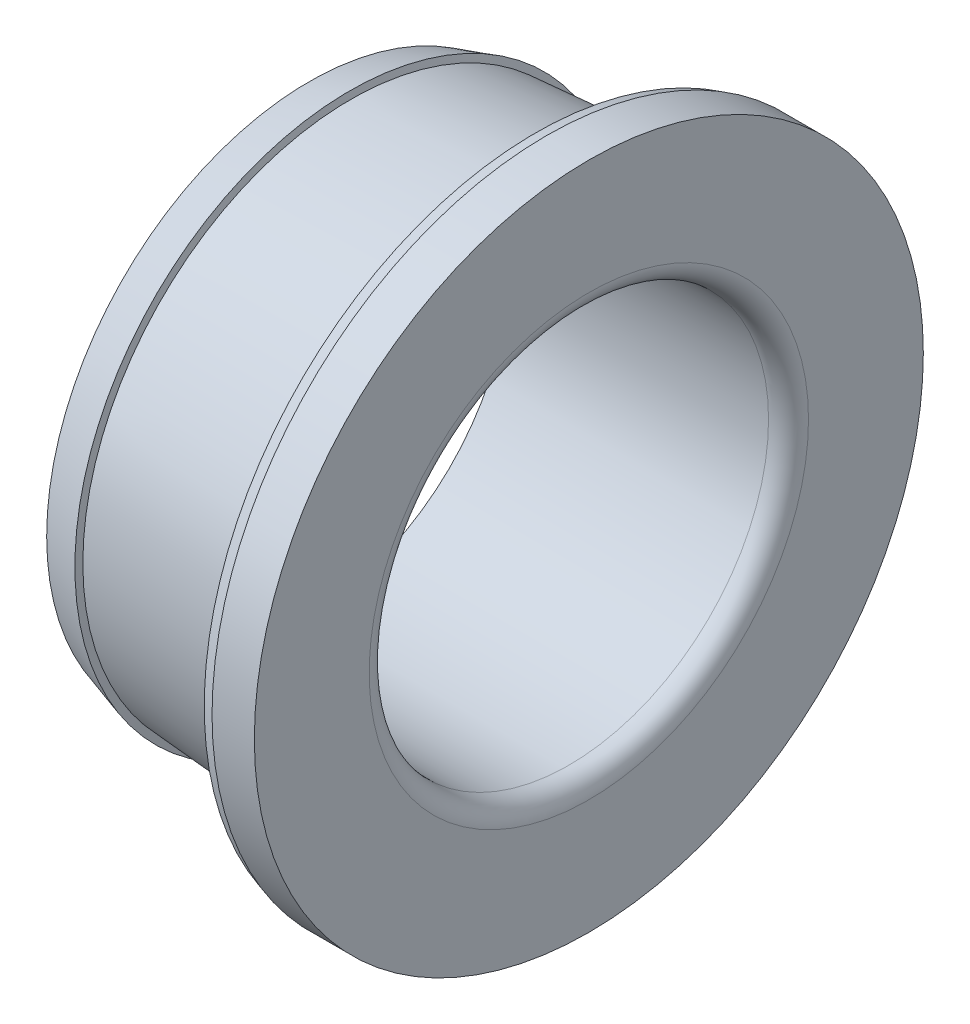
ISO-10303-21;
HEADER;
FILE_DESCRIPTION(('STEP AP214'),'2;1');
FILE_NAME('part.step','',(''),(''),'','','');
FILE_SCHEMA(('AUTOMOTIVE_DESIGN { 1 0 10303 214 1 1 1 1 }'));
ENDSEC;
DATA;
#1=APPLICATION_CONTEXT('core data for automotive mechanical design processes');
#2=APPLICATION_PROTOCOL_DEFINITION('international standard','automotive_design',2000,#1);
#3=PRODUCT_CONTEXT('',#1,'mechanical');
#4=PRODUCT('Part','Part','',(#3));
#5=PRODUCT_RELATED_PRODUCT_CATEGORY('part','',(#4));
#6=PRODUCT_DEFINITION_FORMATION('','',#4);
#7=PRODUCT_DEFINITION_CONTEXT('part definition',#1,'design');
#8=PRODUCT_DEFINITION('design','',#6,#7);
#9=PRODUCT_DEFINITION_SHAPE('','',#8);
#10=(LENGTH_UNIT() NAMED_UNIT(*) SI_UNIT(.MILLI.,.METRE.));
#11=(NAMED_UNIT(*) PLANE_ANGLE_UNIT() SI_UNIT($,.RADIAN.));
#12=(NAMED_UNIT(*) SI_UNIT($,.STERADIAN.) SOLID_ANGLE_UNIT());
#13=UNCERTAINTY_MEASURE_WITH_UNIT(LENGTH_MEASURE(1.E-05),#10,'distance_accuracy_value','');
#14=(GEOMETRIC_REPRESENTATION_CONTEXT(3) GLOBAL_UNCERTAINTY_ASSIGNED_CONTEXT((#13)) GLOBAL_UNIT_ASSIGNED_CONTEXT((#10,
#11,#12)) REPRESENTATION_CONTEXT('',''));
#15=CARTESIAN_POINT('',(0.,0.,0.));
#16=DIRECTION('',(0.,0.,1.));
#17=DIRECTION('',(1.,0.,0.));
#18=AXIS2_PLACEMENT_3D('',#15,#16,#17);
#19=CARTESIAN_POINT('',(3.2764474294567,0.,0.));
#20=DIRECTION('',(1.,0.,0.));
#21=DIRECTION('',(0.,0.,-1.));
#22=AXIS2_PLACEMENT_3D('',#19,#20,#21);
#23=CONICAL_SURFACE('',#22,13.763191322119,0.294287148173128);
#24=CARTESIAN_POINT('',(1.25,0.,0.));
#25=DIRECTION('',(1.,0.,0.));
#26=DIRECTION('',(0.,0.,-1.));
#27=AXIS2_PLACEMENT_3D('',#24,#25,#26);
#28=CIRCLE('',#27,13.149);
#29=CARTESIAN_POINT('',(1.25,0.,-13.149));
#30=VERTEX_POINT('',#29);
#31=EDGE_CURVE('E10',#30,#30,#28,.T.);
#32=ORIENTED_EDGE('',*,*,#31,.T.);
#33=EDGE_LOOP('',(#32));
#34=FACE_BOUND('',#33,.T.);
#35=CARTESIAN_POINT('',(3.2764474294567,0.,0.));
#36=DIRECTION('',(1.,0.,0.));
#37=DIRECTION('',(0.,0.,-1.));
#38=AXIS2_PLACEMENT_3D('',#35,#36,#37);
#39=CIRCLE('',#38,13.763191322119);
#40=CARTESIAN_POINT('',(3.2764474294567,0.,-13.763191322119));
#41=VERTEX_POINT('',#40);
#42=EDGE_CURVE('E67',#41,#41,#39,.T.);
#43=ORIENTED_EDGE('',*,*,#42,.F.);
#44=EDGE_LOOP('',(#43));
#45=FACE_BOUND('',#44,.T.);
#46=ADVANCED_FACE('F33',(#34,#45),#23,.T.);
#47=CARTESIAN_POINT('',(1.25,13.149,0.));
#48=DIRECTION('',(-1.,0.,0.));
#49=DIRECTION('',(0.,0.,1.));
#50=AXIS2_PLACEMENT_3D('',#47,#48,#49);
#51=PLANE('',#50);
#52=CARTESIAN_POINT('',(1.25,0.,0.));
#53=DIRECTION('',(1.,0.,0.));
#54=DIRECTION('',(0.,0.,-1.));
#55=AXIS2_PLACEMENT_3D('',#52,#53,#54);
#56=CIRCLE('',#55,10.);
#57=CARTESIAN_POINT('',(1.25,0.,-10.));
#58=VERTEX_POINT('',#57);
#59=EDGE_CURVE('E39',#58,#58,#56,.T.);
#60=ORIENTED_EDGE('',*,*,#59,.T.);
#61=EDGE_LOOP('',(#60));
#62=FACE_BOUND('',#61,.T.);
#63=ORIENTED_EDGE('',*,*,#31,.F.);
#64=EDGE_LOOP('',(#63));
#65=FACE_BOUND('',#64,.T.);
#66=ADVANCED_FACE('F75',(#62,#65),#51,.T.);
#67=CARTESIAN_POINT('',(1.25,0.,0.));
#68=DIRECTION('',(1.,0.,0.));
#69=DIRECTION('',(0.,0.,-1.));
#70=AXIS2_PLACEMENT_3D('',#67,#68,#69);
#71=CYLINDRICAL_SURFACE('',#70,10.);
#72=CARTESIAN_POINT('',(14.2500000000015,0.,0.));
#73=DIRECTION('',(1.,0.,0.));
#74=DIRECTION('',(0.,0.,-1.));
#75=AXIS2_PLACEMENT_3D('',#72,#73,#74);
#76=CIRCLE('',#75,10.);
#77=CARTESIAN_POINT('',(14.2500000000015,0.,-10.));
#78=VERTEX_POINT('',#77);
#79=EDGE_CURVE('E43',#78,#78,#76,.T.);
#80=ORIENTED_EDGE('',*,*,#79,.T.);
#81=EDGE_LOOP('',(#80));
#82=FACE_BOUND('',#81,.T.);
#83=ORIENTED_EDGE('',*,*,#59,.F.);
#84=EDGE_LOOP('',(#83));
#85=FACE_BOUND('',#84,.T.);
#86=ADVANCED_FACE('F79',(#82,#85),#71,.F.);
#87=CARTESIAN_POINT('',(14.2500000000015,0.,0.));
#88=DIRECTION('',(1.,0.,0.));
#89=DIRECTION('',(0.,0.,-1.));
#90=AXIS2_PLACEMENT_3D('',#87,#88,#89);
#91=TOROIDAL_SURFACE('',#90,10.9999999999984,0.999999999998445);
#92=CARTESIAN_POINT('',(15.25,0.,0.));
#93=DIRECTION('',(1.,0.,0.));
#94=DIRECTION('',(0.,0.,-1.));
#95=AXIS2_PLACEMENT_3D('',#92,#93,#94);
#96=CIRCLE('',#95,10.9999999999984);
#97=CARTESIAN_POINT('',(15.25,0.,-10.9999999999984));
#98=VERTEX_POINT('',#97);
#99=EDGE_CURVE('E47',#98,#98,#96,.T.);
#100=ORIENTED_EDGE('',*,*,#99,.T.);
#101=EDGE_LOOP('',(#100));
#102=FACE_BOUND('',#101,.T.);
#103=ORIENTED_EDGE('',*,*,#79,.F.);
#104=EDGE_LOOP('',(#103));
#105=FACE_BOUND('',#104,.T.);
#106=ADVANCED_FACE('F83',(#102,#105),#91,.T.);
#107=CARTESIAN_POINT('',(15.25,10.9999999999984,0.));
#108=DIRECTION('',(1.,0.,0.));
#109=DIRECTION('',(0.,0.,-1.));
#110=AXIS2_PLACEMENT_3D('',#107,#108,#109);
#111=PLANE('',#110);
#112=CARTESIAN_POINT('',(15.25,0.,0.));
#113=DIRECTION('',(1.,0.,0.));
#114=DIRECTION('',(0.,0.,-1.));
#115=AXIS2_PLACEMENT_3D('',#112,#113,#114);
#116=CIRCLE('',#115,16.7499999999987);
#117=CARTESIAN_POINT('',(15.25,0.,-16.7499999999987));
#118=VERTEX_POINT('',#117);
#119=EDGE_CURVE('E52',#118,#118,#116,.T.);
#120=ORIENTED_EDGE('',*,*,#119,.T.);
#121=EDGE_LOOP('',(#120));
#122=FACE_BOUND('',#121,.T.);
#123=ORIENTED_EDGE('',*,*,#99,.F.);
#124=EDGE_LOOP('',(#123));
#125=FACE_BOUND('',#124,.T.);
#126=ADVANCED_FACE('F90',(#122,#125),#111,.T.);
#127=CARTESIAN_POINT('',(1.25,0.,0.));
#128=DIRECTION('',(1.,0.,0.));
#129=DIRECTION('',(0.,0.,-1.));
#130=AXIS2_PLACEMENT_3D('',#127,#128,#129);
#131=CYLINDRICAL_SURFACE('',#130,16.7499999999987);
#132=CARTESIAN_POINT('',(13.1310490000004,0.,0.));
#133=DIRECTION('',(1.,0.,0.));
#134=DIRECTION('',(0.,0.,-1.));
#135=AXIS2_PLACEMENT_3D('',#132,#133,#134);
#136=CIRCLE('',#135,16.7499999999987);
#137=CARTESIAN_POINT('',(13.1310490000004,0.,-16.7499999999987));
#138=VERTEX_POINT('',#137);
#139=EDGE_CURVE('E55',#138,#138,#136,.T.);
#140=ORIENTED_EDGE('',*,*,#139,.T.);
#141=EDGE_LOOP('',(#140));
#142=FACE_BOUND('',#141,.T.);
#143=ORIENTED_EDGE('',*,*,#119,.F.);
#144=EDGE_LOOP('',(#143));
#145=FACE_BOUND('',#144,.T.);
#146=ADVANCED_FACE('F94',(#142,#145),#131,.T.);
#147=CARTESIAN_POINT('',(13.1310490000004,0.,0.));
#148=DIRECTION('',(1.,0.,0.));
#149=DIRECTION('',(0.,0.,-1.));
#150=AXIS2_PLACEMENT_3D('',#147,#148,#149);
#151=CONICAL_SURFACE('',#150,16.7499999999987,0.294287148173123);
#152=CARTESIAN_POINT('',(12.5702534933722,0.,0.));
#153=DIRECTION('',(1.,0.,0.));
#154=DIRECTION('',(0.,0.,-1.));
#155=AXIS2_PLACEMENT_3D('',#152,#153,#154);
#156=CIRCLE('',#155,16.5800297709922);
#157=CARTESIAN_POINT('',(12.5702534933722,0.,-16.5800297709922));
#158=VERTEX_POINT('',#157);
#159=EDGE_CURVE('E58',#158,#158,#156,.T.);
#160=ORIENTED_EDGE('',*,*,#159,.T.);
#161=EDGE_LOOP('',(#160));
#162=FACE_BOUND('',#161,.T.);
#163=ORIENTED_EDGE('',*,*,#139,.F.);
#164=EDGE_LOOP('',(#163));
#165=FACE_BOUND('',#164,.T.);
#166=ADVANCED_FACE('F98',(#162,#165),#151,.T.);
#167=CARTESIAN_POINT('',(12.5702534933722,0.,0.));
#168=DIRECTION('',(-1.,0.,0.));
#169=DIRECTION('',(0.,0.,1.));
#170=AXIS2_PLACEMENT_3D('',#167,#168,#169);
#171=CONICAL_SURFACE('',#170,16.5800297709922,1.41861644613156);
#172=CARTESIAN_POINT('',(12.9498679004259,0.,0.));
#173=DIRECTION('',(1.,0.,0.));
#174=DIRECTION('',(0.,0.,-1.));
#175=AXIS2_PLACEMENT_3D('',#172,#173,#174);
#176=CIRCLE('',#175,14.1048049891638);
#177=CARTESIAN_POINT('',(12.9498679004259,0.,-14.1048049891638));
#178=VERTEX_POINT('',#177);
#179=EDGE_CURVE('E61',#178,#178,#176,.T.);
#180=ORIENTED_EDGE('',*,*,#179,.T.);
#181=EDGE_LOOP('',(#180));
#182=FACE_BOUND('',#181,.T.);
#183=ORIENTED_EDGE('',*,*,#159,.F.);
#184=EDGE_LOOP('',(#183));
#185=FACE_BOUND('',#184,.T.);
#186=ADVANCED_FACE('F102',(#182,#185),#171,.F.);
#187=CARTESIAN_POINT('',(12.9498679004259,0.,0.));
#188=DIRECTION('',(1.,0.,0.));
#189=DIRECTION('',(0.,0.,-1.));
#190=AXIS2_PLACEMENT_3D('',#187,#188,#189);
#191=CONICAL_SURFACE('',#190,14.1048049891638,0.0712588459538121);
#192=CARTESIAN_POINT('',(3.32937305159778,0.,0.));
#193=DIRECTION('',(1.,0.,0.));
#194=DIRECTION('',(0.,0.,-1.));
#195=AXIS2_PLACEMENT_3D('',#192,#193,#194);
#196=CIRCLE('',#195,13.418096907676);
#197=CARTESIAN_POINT('',(3.32937305159778,0.,-13.418096907676));
#198=VERTEX_POINT('',#197);
#199=EDGE_CURVE('E64',#198,#198,#196,.T.);
#200=ORIENTED_EDGE('',*,*,#199,.T.);
#201=EDGE_LOOP('',(#200));
#202=FACE_BOUND('',#201,.T.);
#203=ORIENTED_EDGE('',*,*,#179,.F.);
#204=EDGE_LOOP('',(#203));
#205=FACE_BOUND('',#204,.T.);
#206=ADVANCED_FACE('F106',(#202,#205),#191,.T.);
#207=CARTESIAN_POINT('',(3.32937305159778,0.,0.));
#208=DIRECTION('',(-1.,0.,0.));
#209=DIRECTION('',(0.,0.,1.));
#210=AXIS2_PLACEMENT_3D('',#207,#208,#209);
#211=CONICAL_SURFACE('',#210,13.418096907676,1.41861644613046);
#212=ORIENTED_EDGE('',*,*,#42,.T.);
#213=EDGE_LOOP('',(#212));
#214=FACE_BOUND('',#213,.T.);
#215=ORIENTED_EDGE('',*,*,#199,.F.);
#216=EDGE_LOOP('',(#215));
#217=FACE_BOUND('',#216,.T.);
#218=ADVANCED_FACE('F71',(#214,#217),#211,.T.);
#219=CLOSED_SHELL('',(#46,#66,#86,#106,#126,#146,#166,#186,#206,#218));
#220=MANIFOLD_SOLID_BREP('B2',#219);
#221=ADVANCED_BREP_SHAPE_REPRESENTATION('',(#18,#220),#14);
#222=SHAPE_DEFINITION_REPRESENTATION(#9,#221);
ENDSEC;
END-ISO-10303-21;
